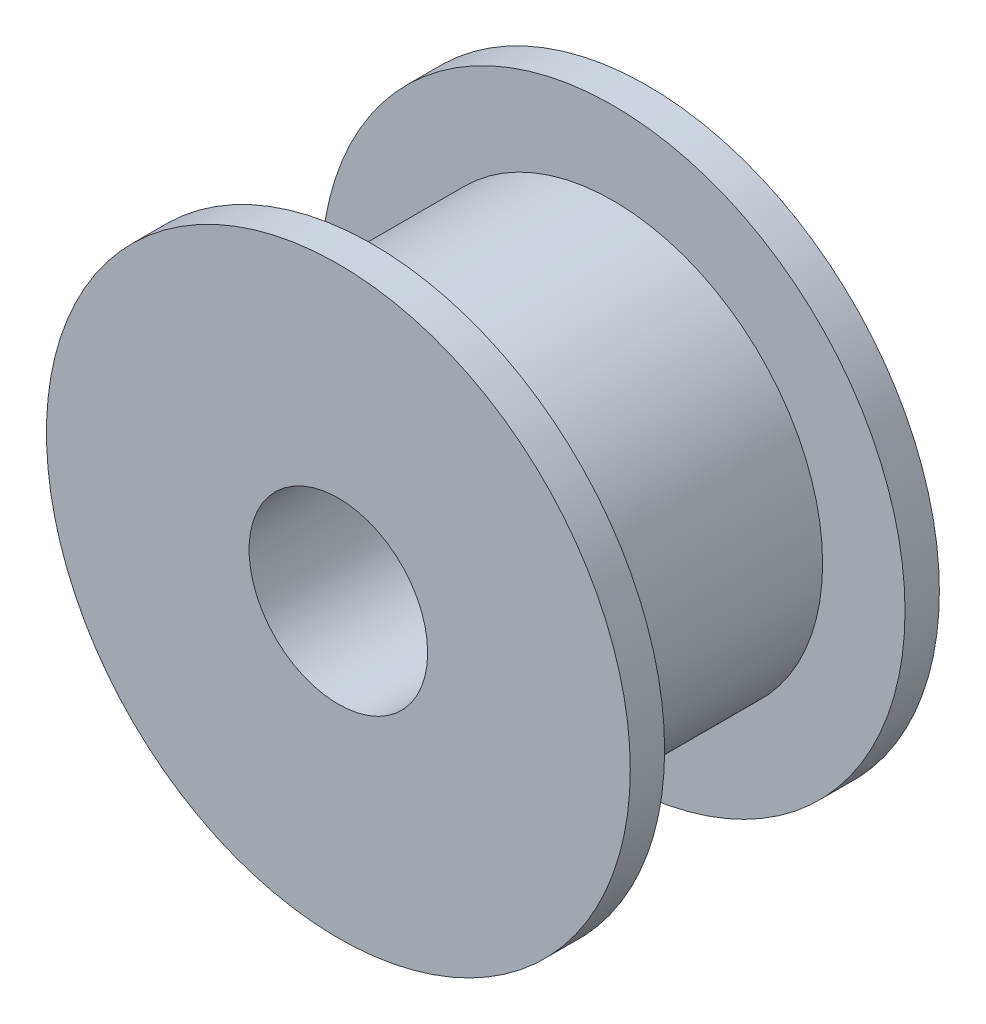
ISO-10303-21;
HEADER;
FILE_DESCRIPTION(('STEP AP214'),'2;1');
FILE_NAME('part.step','',(''),(''),'','','');
FILE_SCHEMA(('AUTOMOTIVE_DESIGN { 1 0 10303 214 1 1 1 1 }'));
ENDSEC;
DATA;
#1=APPLICATION_CONTEXT('core data for automotive mechanical design processes');
#2=APPLICATION_PROTOCOL_DEFINITION('international standard','automotive_design',2000,#1);
#3=PRODUCT_CONTEXT('',#1,'mechanical');
#4=PRODUCT('Part','Part','',(#3));
#5=PRODUCT_RELATED_PRODUCT_CATEGORY('part','',(#4));
#6=PRODUCT_DEFINITION_FORMATION('','',#4);
#7=PRODUCT_DEFINITION_CONTEXT('part definition',#1,'design');
#8=PRODUCT_DEFINITION('design','',#6,#7);
#9=PRODUCT_DEFINITION_SHAPE('','',#8);
#10=(LENGTH_UNIT() NAMED_UNIT(*) SI_UNIT(.MILLI.,.METRE.));
#11=(NAMED_UNIT(*) PLANE_ANGLE_UNIT() SI_UNIT($,.RADIAN.));
#12=(NAMED_UNIT(*) SI_UNIT($,.STERADIAN.) SOLID_ANGLE_UNIT());
#13=UNCERTAINTY_MEASURE_WITH_UNIT(LENGTH_MEASURE(1.E-05),#10,'distance_accuracy_value','');
#14=(GEOMETRIC_REPRESENTATION_CONTEXT(3) GLOBAL_UNCERTAINTY_ASSIGNED_CONTEXT((#13)) GLOBAL_UNIT_ASSIGNED_CONTEXT((#10,
#11,#12)) REPRESENTATION_CONTEXT('',''));
#15=CARTESIAN_POINT('',(0.,0.,0.));
#16=DIRECTION('',(0.,0.,1.));
#17=DIRECTION('',(1.,0.,0.));
#18=AXIS2_PLACEMENT_3D('',#15,#16,#17);
#19=CARTESIAN_POINT('',(0.,0.,0.));
#20=DIRECTION('',(0.,0.,1.));
#21=DIRECTION('',(1.,0.,0.));
#22=AXIS2_PLACEMENT_3D('',#19,#20,#21);
#23=CYLINDRICAL_SURFACE('',#22,8.5);
#24=CARTESIAN_POINT('',(0.,0.,1.));
#25=DIRECTION('',(0.,0.,1.));
#26=DIRECTION('',(1.,0.,0.));
#27=AXIS2_PLACEMENT_3D('',#24,#25,#26);
#28=CIRCLE('',#27,8.5);
#29=CARTESIAN_POINT('',(8.5,0.,1.));
#30=VERTEX_POINT('',#29);
#31=EDGE_CURVE('E9',#30,#30,#28,.T.);
#32=ORIENTED_EDGE('',*,*,#31,.F.);
#33=EDGE_LOOP('',(#32));
#34=FACE_BOUND('',#33,.T.);
#35=CARTESIAN_POINT('',(0.,0.,0.));
#36=DIRECTION('',(0.,0.,1.));
#37=DIRECTION('',(1.,0.,0.));
#38=AXIS2_PLACEMENT_3D('',#35,#36,#37);
#39=CIRCLE('',#38,8.5);
#40=CARTESIAN_POINT('',(8.5,0.,0.));
#41=VERTEX_POINT('',#40);
#42=EDGE_CURVE('E22',#41,#41,#39,.T.);
#43=ORIENTED_EDGE('',*,*,#42,.T.);
#44=EDGE_LOOP('',(#43));
#45=FACE_BOUND('',#44,.T.);
#46=ADVANCED_FACE('F14',(#34,#45),#23,.T.);
#47=CARTESIAN_POINT('',(0.,0.,1.));
#48=DIRECTION('',(0.,0.,1.));
#49=DIRECTION('',(1.,0.,0.));
#50=AXIS2_PLACEMENT_3D('',#47,#48,#49);
#51=PLANE('',#50);
#52=CARTESIAN_POINT('',(0.,0.,1.));
#53=DIRECTION('',(0.,0.,1.));
#54=DIRECTION('',(1.,0.,0.));
#55=AXIS2_PLACEMENT_3D('',#52,#53,#54);
#56=CIRCLE('',#55,6.1);
#57=CARTESIAN_POINT('',(6.1,0.,1.));
#58=VERTEX_POINT('',#57);
#59=EDGE_CURVE('E31',#58,#58,#56,.T.);
#60=ORIENTED_EDGE('',*,*,#59,.F.);
#61=EDGE_LOOP('',(#60));
#62=FACE_BOUND('',#61,.T.);
#63=ORIENTED_EDGE('',*,*,#31,.T.);
#64=EDGE_LOOP('',(#63));
#65=FACE_BOUND('',#64,.T.);
#66=ADVANCED_FACE('F92',(#62,#65),#51,.T.);
#67=CARTESIAN_POINT('',(0.,0.,0.));
#68=DIRECTION('',(0.,0.,1.));
#69=DIRECTION('',(1.,0.,0.));
#70=AXIS2_PLACEMENT_3D('',#67,#68,#69);
#71=PLANE('',#70);
#72=CARTESIAN_POINT('',(0.,0.,0.));
#73=DIRECTION('',(0.,0.,1.));
#74=DIRECTION('',(1.,0.,0.));
#75=AXIS2_PLACEMENT_3D('',#72,#73,#74);
#76=CIRCLE('',#75,2.6);
#77=CARTESIAN_POINT('',(2.6,0.,0.));
#78=VERTEX_POINT('',#77);
#79=EDGE_CURVE('E39',#78,#78,#76,.T.);
#80=ORIENTED_EDGE('',*,*,#79,.T.);
#81=EDGE_LOOP('',(#80));
#82=FACE_BOUND('',#81,.T.);
#83=ORIENTED_EDGE('',*,*,#42,.F.);
#84=EDGE_LOOP('',(#83));
#85=FACE_BOUND('',#84,.T.);
#86=ADVANCED_FACE('F16',(#82,#85),#71,.F.);
#87=CARTESIAN_POINT('',(0.,0.,1.));
#88=DIRECTION('',(0.,0.,1.));
#89=DIRECTION('',(1.,0.,0.));
#90=AXIS2_PLACEMENT_3D('',#87,#88,#89);
#91=CYLINDRICAL_SURFACE('',#90,6.1);
#92=CARTESIAN_POINT('',(0.,0.,8.));
#93=DIRECTION('',(0.,0.,1.));
#94=DIRECTION('',(1.,0.,0.));
#95=AXIS2_PLACEMENT_3D('',#92,#93,#94);
#96=CIRCLE('',#95,6.1);
#97=CARTESIAN_POINT('',(6.1,0.,8.));
#98=VERTEX_POINT('',#97);
#99=EDGE_CURVE('E42',#98,#98,#96,.T.);
#100=ORIENTED_EDGE('',*,*,#99,.F.);
#101=EDGE_LOOP('',(#100));
#102=FACE_BOUND('',#101,.T.);
#103=ORIENTED_EDGE('',*,*,#59,.T.);
#104=EDGE_LOOP('',(#103));
#105=FACE_BOUND('',#104,.T.);
#106=ADVANCED_FACE('F88',(#102,#105),#91,.T.);
#107=CARTESIAN_POINT('',(0.,0.,-1.));
#108=DIRECTION('',(0.,0.,1.));
#109=DIRECTION('',(1.,0.,0.));
#110=AXIS2_PLACEMENT_3D('',#107,#108,#109);
#111=CYLINDRICAL_SURFACE('',#110,2.6);
#112=CARTESIAN_POINT('',(0.,0.,9.));
#113=DIRECTION('',(0.,0.,1.));
#114=DIRECTION('',(1.,0.,0.));
#115=AXIS2_PLACEMENT_3D('',#112,#113,#114);
#116=CIRCLE('',#115,2.6);
#117=CARTESIAN_POINT('',(2.6,0.,9.));
#118=VERTEX_POINT('',#117);
#119=EDGE_CURVE('E49',#118,#118,#116,.T.);
#120=ORIENTED_EDGE('',*,*,#119,.T.);
#121=EDGE_LOOP('',(#120));
#122=FACE_BOUND('',#121,.T.);
#123=ORIENTED_EDGE('',*,*,#79,.F.);
#124=EDGE_LOOP('',(#123));
#125=FACE_BOUND('',#124,.T.);
#126=ADVANCED_FACE('F79',(#122,#125),#111,.F.);
#127=CARTESIAN_POINT('',(0.,0.,8.));
#128=DIRECTION('',(0.,0.,1.));
#129=DIRECTION('',(1.,0.,0.));
#130=AXIS2_PLACEMENT_3D('',#127,#128,#129);
#131=PLANE('',#130);
#132=ORIENTED_EDGE('',*,*,#99,.T.);
#133=EDGE_LOOP('',(#132));
#134=FACE_BOUND('',#133,.T.);
#135=CARTESIAN_POINT('',(0.,0.,8.));
#136=DIRECTION('',(0.,0.,1.));
#137=DIRECTION('',(1.,0.,0.));
#138=AXIS2_PLACEMENT_3D('',#135,#136,#137);
#139=CIRCLE('',#138,8.5);
#140=CARTESIAN_POINT('',(8.5,0.,8.));
#141=VERTEX_POINT('',#140);
#142=EDGE_CURVE('E55',#141,#141,#139,.T.);
#143=ORIENTED_EDGE('',*,*,#142,.F.);
#144=EDGE_LOOP('',(#143));
#145=FACE_BOUND('',#144,.T.);
#146=ADVANCED_FACE('F77',(#134,#145),#131,.F.);
#147=CARTESIAN_POINT('',(0.,0.,9.));
#148=DIRECTION('',(0.,0.,1.));
#149=DIRECTION('',(1.,0.,0.));
#150=AXIS2_PLACEMENT_3D('',#147,#148,#149);
#151=PLANE('',#150);
#152=ORIENTED_EDGE('',*,*,#119,.F.);
#153=EDGE_LOOP('',(#152));
#154=FACE_BOUND('',#153,.T.);
#155=CARTESIAN_POINT('',(0.,0.,9.));
#156=DIRECTION('',(0.,0.,1.));
#157=DIRECTION('',(1.,0.,0.));
#158=AXIS2_PLACEMENT_3D('',#155,#156,#157);
#159=CIRCLE('',#158,8.5);
#160=CARTESIAN_POINT('',(8.5,0.,9.));
#161=VERTEX_POINT('',#160);
#162=EDGE_CURVE('E62',#161,#161,#159,.T.);
#163=ORIENTED_EDGE('',*,*,#162,.T.);
#164=EDGE_LOOP('',(#163));
#165=FACE_BOUND('',#164,.T.);
#166=ADVANCED_FACE('F69',(#154,#165),#151,.T.);
#167=CARTESIAN_POINT('',(0.,0.,8.));
#168=DIRECTION('',(0.,0.,1.));
#169=DIRECTION('',(1.,0.,0.));
#170=AXIS2_PLACEMENT_3D('',#167,#168,#169);
#171=CYLINDRICAL_SURFACE('',#170,8.5);
#172=ORIENTED_EDGE('',*,*,#162,.F.);
#173=EDGE_LOOP('',(#172));
#174=FACE_BOUND('',#173,.T.);
#175=ORIENTED_EDGE('',*,*,#142,.T.);
#176=EDGE_LOOP('',(#175));
#177=FACE_BOUND('',#176,.T.);
#178=ADVANCED_FACE('F71',(#174,#177),#171,.T.);
#179=CLOSED_SHELL('',(#46,#66,#86,#106,#126,#146,#166,#178));
#180=MANIFOLD_SOLID_BREP('B1',#179);
#181=ADVANCED_BREP_SHAPE_REPRESENTATION('',(#18,#180),#14);
#182=SHAPE_DEFINITION_REPRESENTATION(#9,#181);
ENDSEC;
END-ISO-10303-21;
